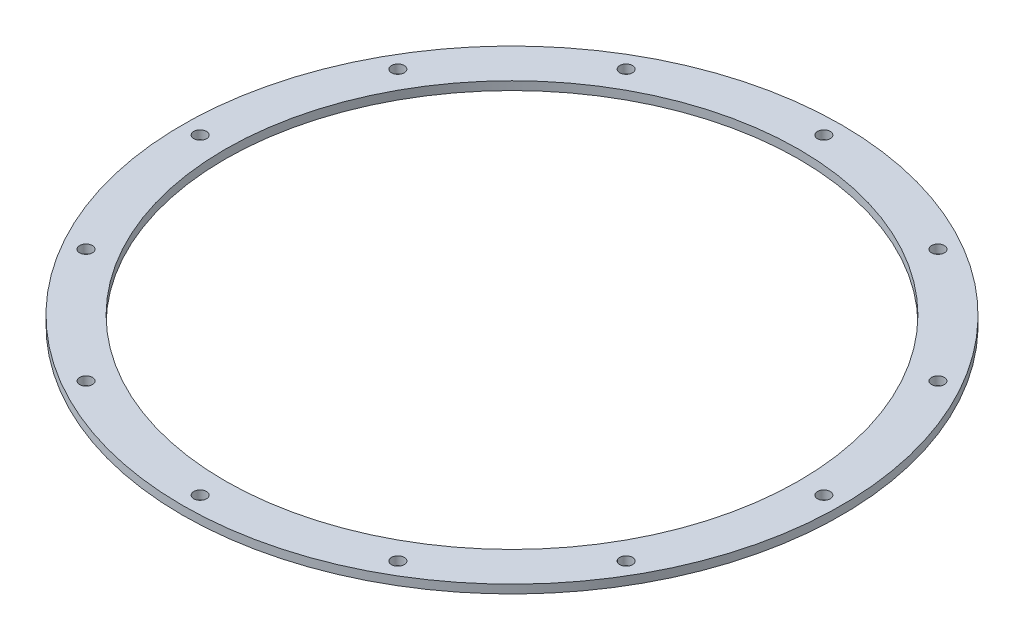
ISO-10303-21;
HEADER;
FILE_DESCRIPTION(('STEP AP214'),'2;1');
FILE_NAME('part.step','',(''),(''),'','','');
FILE_SCHEMA(('AUTOMOTIVE_DESIGN { 1 0 10303 214 1 1 1 1 }'));
ENDSEC;
DATA;
#1=APPLICATION_CONTEXT('core data for automotive mechanical design processes');
#2=APPLICATION_PROTOCOL_DEFINITION('international standard','automotive_design',2000,#1);
#3=PRODUCT_CONTEXT('',#1,'mechanical');
#4=PRODUCT('Part','Part','',(#3));
#5=PRODUCT_RELATED_PRODUCT_CATEGORY('part','',(#4));
#6=PRODUCT_DEFINITION_FORMATION('','',#4);
#7=PRODUCT_DEFINITION_CONTEXT('part definition',#1,'design');
#8=PRODUCT_DEFINITION('design','',#6,#7);
#9=PRODUCT_DEFINITION_SHAPE('','',#8);
#10=(LENGTH_UNIT() NAMED_UNIT(*) SI_UNIT(.MILLI.,.METRE.));
#11=(NAMED_UNIT(*) PLANE_ANGLE_UNIT() SI_UNIT($,.RADIAN.));
#12=(NAMED_UNIT(*) SI_UNIT($,.STERADIAN.) SOLID_ANGLE_UNIT());
#13=UNCERTAINTY_MEASURE_WITH_UNIT(LENGTH_MEASURE(1.E-05),#10,'distance_accuracy_value','');
#14=(GEOMETRIC_REPRESENTATION_CONTEXT(3) GLOBAL_UNCERTAINTY_ASSIGNED_CONTEXT((#13)) GLOBAL_UNIT_ASSIGNED_CONTEXT((#10,
#11,#12)) REPRESENTATION_CONTEXT('',''));
#15=CARTESIAN_POINT('',(0.,0.,0.));
#16=DIRECTION('',(0.,0.,1.));
#17=DIRECTION('',(1.,0.,0.));
#18=AXIS2_PLACEMENT_3D('',#15,#16,#17);
#19=CARTESIAN_POINT('',(0.,6.00000000000001,0.));
#20=DIRECTION('',(0.,1.,0.));
#21=DIRECTION('',(0.,0.,1.));
#22=AXIS2_PLACEMENT_3D('',#19,#20,#21);
#23=PLANE('',#22);
#24=CARTESIAN_POINT('',(-190.525588832577,6.00000000000001,-110.));
#25=DIRECTION('',(0.,1.,0.));
#26=DIRECTION('',(0.86602540378444,0.,0.499999999999998));
#27=AXIS2_PLACEMENT_3D('',#24,#25,#26);
#28=CIRCLE('',#27,4.5);
#29=CARTESIAN_POINT('',(-186.628474515547,6.00000000000001,-107.75));
#30=VERTEX_POINT('',#29);
#31=EDGE_CURVE('E128',#30,#30,#28,.T.);
#32=ORIENTED_EDGE('',*,*,#31,.F.);
#33=EDGE_LOOP('',(#32));
#34=FACE_BOUND('',#33,.T.);
#35=CARTESIAN_POINT('',(-220.,6.00000000000001,7.6812589454549E-13));
#36=DIRECTION('',(0.,1.,0.));
#37=DIRECTION('',(1.,0.,0.));
#38=AXIS2_PLACEMENT_3D('',#35,#36,#37);
#39=CIRCLE('',#38,4.5);
#40=CARTESIAN_POINT('',(-215.5,6.00000000000001,7.52414228520696E-13));
#41=VERTEX_POINT('',#40);
#42=EDGE_CURVE('E120',#41,#41,#39,.T.);
#43=ORIENTED_EDGE('',*,*,#42,.F.);
#44=EDGE_LOOP('',(#43));
#45=FACE_BOUND('',#44,.T.);
#46=CARTESIAN_POINT('',(-190.525588832576,6.00000000000001,110.000000000001));
#47=DIRECTION('',(0.,1.,0.));
#48=DIRECTION('',(0.866025403784437,0.,-0.500000000000004));
#49=AXIS2_PLACEMENT_3D('',#46,#47,#48);
#50=CIRCLE('',#49,4.5);
#51=CARTESIAN_POINT('',(-186.628474515546,6.00000000000001,107.750000000001));
#52=VERTEX_POINT('',#51);
#53=EDGE_CURVE('E112',#52,#52,#50,.T.);
#54=ORIENTED_EDGE('',*,*,#53,.F.);
#55=EDGE_LOOP('',(#54));
#56=FACE_BOUND('',#55,.T.);
#57=CARTESIAN_POINT('',(-109.999999999999,6.00000000000001,190.525588832577));
#58=DIRECTION('',(0.,1.,0.));
#59=DIRECTION('',(0.499999999999995,0.,-0.866025403784442));
#60=AXIS2_PLACEMENT_3D('',#57,#58,#59);
#61=CIRCLE('',#60,4.5);
#62=CARTESIAN_POINT('',(-107.749999999999,6.00000000000001,186.628474515547));
#63=VERTEX_POINT('',#62);
#64=EDGE_CURVE('E104',#63,#63,#61,.T.);
#65=ORIENTED_EDGE('',*,*,#64,.F.);
#66=EDGE_LOOP('',(#65));
#67=FACE_BOUND('',#66,.T.);
#68=CARTESIAN_POINT('',(0.,6.00000000000001,220.));
#69=DIRECTION('',(0.,1.,0.));
#70=DIRECTION('',(0.,0.,-1.));
#71=AXIS2_PLACEMENT_3D('',#68,#69,#70);
#72=CIRCLE('',#71,4.5);
#73=CARTESIAN_POINT('',(0.,6.00000000000001,215.5));
#74=VERTEX_POINT('',#73);
#75=EDGE_CURVE('E96',#74,#74,#72,.T.);
#76=ORIENTED_EDGE('',*,*,#75,.F.);
#77=EDGE_LOOP('',(#76));
#78=FACE_BOUND('',#77,.T.);
#79=CARTESIAN_POINT('',(110.000000000002,6.00000000000001,190.525588832576));
#80=DIRECTION('',(0.,1.,0.));
#81=DIRECTION('',(-0.500000000000007,0.,-0.866025403784435));
#82=AXIS2_PLACEMENT_3D('',#79,#80,#81);
#83=CIRCLE('',#82,4.5);
#84=CARTESIAN_POINT('',(107.750000000002,6.00000000000001,186.628474515546));
#85=VERTEX_POINT('',#84);
#86=EDGE_CURVE('E88',#85,#85,#83,.T.);
#87=ORIENTED_EDGE('',*,*,#86,.F.);
#88=EDGE_LOOP('',(#87));
#89=FACE_BOUND('',#88,.T.);
#90=CARTESIAN_POINT('',(190.525588832578,6.00000000000001,109.999999999998));
#91=DIRECTION('',(0.,1.,0.));
#92=DIRECTION('',(-0.866025403784444,0.,-0.499999999999992));
#93=AXIS2_PLACEMENT_3D('',#90,#91,#92);
#94=CIRCLE('',#93,4.5);
#95=CARTESIAN_POINT('',(186.628474515548,6.00000000000001,107.749999999998));
#96=VERTEX_POINT('',#95);
#97=EDGE_CURVE('E78',#96,#96,#94,.T.);
#98=ORIENTED_EDGE('',*,*,#97,.F.);
#99=EDGE_LOOP('',(#98));
#100=FACE_BOUND('',#99,.T.);
#101=CARTESIAN_POINT('',(220.,6.00000000000001,-2.30437768363647E-12));
#102=DIRECTION('',(0.,1.,0.));
#103=DIRECTION('',(-1.,0.,0.));
#104=AXIS2_PLACEMENT_3D('',#101,#102,#103);
#105=CIRCLE('',#104,4.5);
#106=CARTESIAN_POINT('',(215.5,6.00000000000001,-2.25724268556209E-12));
#107=VERTEX_POINT('',#106);
#108=EDGE_CURVE('E79',#107,#107,#105,.T.);
#109=ORIENTED_EDGE('',*,*,#108,.F.);
#110=EDGE_LOOP('',(#109));
#111=FACE_BOUND('',#110,.T.);
#112=CARTESIAN_POINT('',(190.525588832575,6.00000000000001,-110.000000000002));
#113=DIRECTION('',(0.,1.,0.));
#114=DIRECTION('',(-0.866025403784433,0.,0.50000000000001));
#115=AXIS2_PLACEMENT_3D('',#112,#113,#114);
#116=CIRCLE('',#115,4.5);
#117=CARTESIAN_POINT('',(186.628474515545,6.00000000000001,-107.750000000002));
#118=VERTEX_POINT('',#117);
#119=EDGE_CURVE('E142',#118,#118,#116,.T.);
#120=ORIENTED_EDGE('',*,*,#119,.F.);
#121=EDGE_LOOP('',(#120));
#122=FACE_BOUND('',#121,.T.);
#123=CARTESIAN_POINT('',(109.999999999998,6.00000000000001,-190.525588832578));
#124=DIRECTION('',(0.,1.,0.));
#125=DIRECTION('',(-0.499999999999989,0.,0.866025403784445));
#126=AXIS2_PLACEMENT_3D('',#123,#124,#125);
#127=CIRCLE('',#126,4.5);
#128=CARTESIAN_POINT('',(107.749999999998,6.00000000000001,-186.628474515548));
#129=VERTEX_POINT('',#128);
#130=EDGE_CURVE('E143',#129,#129,#127,.T.);
#131=ORIENTED_EDGE('',*,*,#130,.F.);
#132=EDGE_LOOP('',(#131));
#133=FACE_BOUND('',#132,.T.);
#134=CARTESIAN_POINT('',(-110.,6.00000000000001,-190.525588832576));
#135=DIRECTION('',(0.,1.,0.));
#136=DIRECTION('',(0.500000000000001,0.,0.866025403784438));
#137=AXIS2_PLACEMENT_3D('',#134,#135,#136);
#138=CIRCLE('',#137,4.5);
#139=CARTESIAN_POINT('',(-107.75,6.00000000000001,-186.628474515547));
#140=VERTEX_POINT('',#139);
#141=EDGE_CURVE('E69',#140,#140,#138,.T.);
#142=ORIENTED_EDGE('',*,*,#141,.F.);
#143=EDGE_LOOP('',(#142));
#144=FACE_BOUND('',#143,.T.);
#145=CARTESIAN_POINT('',(0.,6.00000000000001,-220.));
#146=DIRECTION('',(0.,1.,0.));
#147=DIRECTION('',(0.,0.,1.));
#148=AXIS2_PLACEMENT_3D('',#145,#146,#147);
#149=CIRCLE('',#148,4.5);
#150=CARTESIAN_POINT('',(0.,6.00000000000001,-215.5));
#151=VERTEX_POINT('',#150);
#152=EDGE_CURVE('E61',#151,#151,#149,.T.);
#153=ORIENTED_EDGE('',*,*,#152,.F.);
#154=EDGE_LOOP('',(#153));
#155=FACE_BOUND('',#154,.T.);
#156=CARTESIAN_POINT('',(0.,6.00000000000001,0.));
#157=DIRECTION('',(0.,1.,0.));
#158=DIRECTION('',(0.,0.,1.));
#159=AXIS2_PLACEMENT_3D('',#156,#157,#158);
#160=CIRCLE('',#159,232.5);
#161=CARTESIAN_POINT('',(0.,6.00000000000001,232.5));
#162=VERTEX_POINT('',#161);
#163=EDGE_CURVE('E10',#162,#162,#160,.T.);
#164=ORIENTED_EDGE('',*,*,#163,.T.);
#165=EDGE_LOOP('',(#164));
#166=FACE_BOUND('',#165,.T.);
#167=CARTESIAN_POINT('',(0.,6.00000000000001,0.));
#168=DIRECTION('',(0.,1.,0.));
#169=DIRECTION('',(0.,0.,1.));
#170=AXIS2_PLACEMENT_3D('',#167,#168,#169);
#171=CIRCLE('',#170,202.5);
#172=CARTESIAN_POINT('',(0.,6.00000000000001,202.5));
#173=VERTEX_POINT('',#172);
#174=EDGE_CURVE('E52',#173,#173,#171,.T.);
#175=ORIENTED_EDGE('',*,*,#174,.F.);
#176=EDGE_LOOP('',(#175));
#177=FACE_BOUND('',#176,.T.);
#178=ADVANCED_FACE('F36',(#34,#45,#56,#67,#78,#89,#100,#111,#122,#133,#144,#155,#166,#177),#23,.T.);
#179=CARTESIAN_POINT('',(0.,0.,0.));
#180=DIRECTION('',(0.,1.,0.));
#181=DIRECTION('',(0.,0.,1.));
#182=AXIS2_PLACEMENT_3D('',#179,#180,#181);
#183=PLANE('',#182);
#184=CARTESIAN_POINT('',(-190.525588832577,0.,-110.));
#185=DIRECTION('',(0.,1.,0.));
#186=DIRECTION('',(0.86602540378444,0.,0.499999999999998));
#187=AXIS2_PLACEMENT_3D('',#184,#185,#186);
#188=CIRCLE('',#187,4.5);
#189=CARTESIAN_POINT('',(-186.628474515547,0.,-107.75));
#190=VERTEX_POINT('',#189);
#191=EDGE_CURVE('E73',#190,#190,#188,.T.);
#192=ORIENTED_EDGE('',*,*,#191,.T.);
#193=EDGE_LOOP('',(#192));
#194=FACE_BOUND('',#193,.T.);
#195=CARTESIAN_POINT('',(-220.,0.,7.6812589454549E-13));
#196=DIRECTION('',(0.,1.,0.));
#197=DIRECTION('',(1.,0.,0.));
#198=AXIS2_PLACEMENT_3D('',#195,#196,#197);
#199=CIRCLE('',#198,4.5);
#200=CARTESIAN_POINT('',(-215.5,0.,7.52414228520696E-13));
#201=VERTEX_POINT('',#200);
#202=EDGE_CURVE('E124',#201,#201,#199,.T.);
#203=ORIENTED_EDGE('',*,*,#202,.T.);
#204=EDGE_LOOP('',(#203));
#205=FACE_BOUND('',#204,.T.);
#206=CARTESIAN_POINT('',(-190.525588832576,0.,110.000000000001));
#207=DIRECTION('',(0.,1.,0.));
#208=DIRECTION('',(0.866025403784437,0.,-0.500000000000004));
#209=AXIS2_PLACEMENT_3D('',#206,#207,#208);
#210=CIRCLE('',#209,4.5);
#211=CARTESIAN_POINT('',(-186.628474515546,0.,107.750000000001));
#212=VERTEX_POINT('',#211);
#213=EDGE_CURVE('E116',#212,#212,#210,.T.);
#214=ORIENTED_EDGE('',*,*,#213,.T.);
#215=EDGE_LOOP('',(#214));
#216=FACE_BOUND('',#215,.T.);
#217=CARTESIAN_POINT('',(-109.999999999999,0.,190.525588832577));
#218=DIRECTION('',(0.,1.,0.));
#219=DIRECTION('',(0.499999999999995,0.,-0.866025403784442));
#220=AXIS2_PLACEMENT_3D('',#217,#218,#219);
#221=CIRCLE('',#220,4.5);
#222=CARTESIAN_POINT('',(-107.749999999999,0.,186.628474515547));
#223=VERTEX_POINT('',#222);
#224=EDGE_CURVE('E108',#223,#223,#221,.T.);
#225=ORIENTED_EDGE('',*,*,#224,.T.);
#226=EDGE_LOOP('',(#225));
#227=FACE_BOUND('',#226,.T.);
#228=CARTESIAN_POINT('',(0.,0.,220.));
#229=DIRECTION('',(0.,1.,0.));
#230=DIRECTION('',(0.,0.,-1.));
#231=AXIS2_PLACEMENT_3D('',#228,#229,#230);
#232=CIRCLE('',#231,4.5);
#233=CARTESIAN_POINT('',(0.,0.,215.5));
#234=VERTEX_POINT('',#233);
#235=EDGE_CURVE('E100',#234,#234,#232,.T.);
#236=ORIENTED_EDGE('',*,*,#235,.T.);
#237=EDGE_LOOP('',(#236));
#238=FACE_BOUND('',#237,.T.);
#239=CARTESIAN_POINT('',(110.000000000002,0.,190.525588832576));
#240=DIRECTION('',(0.,1.,0.));
#241=DIRECTION('',(-0.500000000000007,0.,-0.866025403784435));
#242=AXIS2_PLACEMENT_3D('',#239,#240,#241);
#243=CIRCLE('',#242,4.5);
#244=CARTESIAN_POINT('',(107.750000000002,0.,186.628474515546));
#245=VERTEX_POINT('',#244);
#246=EDGE_CURVE('E92',#245,#245,#243,.T.);
#247=ORIENTED_EDGE('',*,*,#246,.T.);
#248=EDGE_LOOP('',(#247));
#249=FACE_BOUND('',#248,.T.);
#250=CARTESIAN_POINT('',(190.525588832578,0.,109.999999999998));
#251=DIRECTION('',(0.,1.,0.));
#252=DIRECTION('',(-0.866025403784444,0.,-0.499999999999992));
#253=AXIS2_PLACEMENT_3D('',#250,#251,#252);
#254=CIRCLE('',#253,4.5);
#255=CARTESIAN_POINT('',(186.628474515548,0.,107.749999999998));
#256=VERTEX_POINT('',#255);
#257=EDGE_CURVE('E84',#256,#256,#254,.T.);
#258=ORIENTED_EDGE('',*,*,#257,.T.);
#259=EDGE_LOOP('',(#258));
#260=FACE_BOUND('',#259,.T.);
#261=CARTESIAN_POINT('',(220.,0.,-2.30437768363647E-12));
#262=DIRECTION('',(0.,1.,0.));
#263=DIRECTION('',(-1.,0.,0.));
#264=AXIS2_PLACEMENT_3D('',#261,#262,#263);
#265=CIRCLE('',#264,4.5);
#266=CARTESIAN_POINT('',(215.5,0.,-2.25724268556209E-12));
#267=VERTEX_POINT('',#266);
#268=EDGE_CURVE('E74',#267,#267,#265,.T.);
#269=ORIENTED_EDGE('',*,*,#268,.T.);
#270=EDGE_LOOP('',(#269));
#271=FACE_BOUND('',#270,.T.);
#272=CARTESIAN_POINT('',(190.525588832575,0.,-110.000000000002));
#273=DIRECTION('',(0.,1.,0.));
#274=DIRECTION('',(-0.866025403784433,0.,0.50000000000001));
#275=AXIS2_PLACEMENT_3D('',#272,#273,#274);
#276=CIRCLE('',#275,4.5);
#277=CARTESIAN_POINT('',(186.628474515545,0.,-107.750000000002));
#278=VERTEX_POINT('',#277);
#279=EDGE_CURVE('E83',#278,#278,#276,.T.);
#280=ORIENTED_EDGE('',*,*,#279,.T.);
#281=EDGE_LOOP('',(#280));
#282=FACE_BOUND('',#281,.T.);
#283=CARTESIAN_POINT('',(109.999999999998,0.,-190.525588832578));
#284=DIRECTION('',(0.,1.,0.));
#285=DIRECTION('',(-0.499999999999989,0.,0.866025403784445));
#286=AXIS2_PLACEMENT_3D('',#283,#284,#285);
#287=CIRCLE('',#286,4.5);
#288=CARTESIAN_POINT('',(107.749999999998,0.,-186.628474515548));
#289=VERTEX_POINT('',#288);
#290=EDGE_CURVE('E138',#289,#289,#287,.T.);
#291=ORIENTED_EDGE('',*,*,#290,.T.);
#292=EDGE_LOOP('',(#291));
#293=FACE_BOUND('',#292,.T.);
#294=CARTESIAN_POINT('',(-110.,0.,-190.525588832576));
#295=DIRECTION('',(0.,1.,0.));
#296=DIRECTION('',(0.500000000000001,0.,0.866025403784438));
#297=AXIS2_PLACEMENT_3D('',#294,#295,#296);
#298=CIRCLE('',#297,4.5);
#299=CARTESIAN_POINT('',(-107.75,0.,-186.628474515547));
#300=VERTEX_POINT('',#299);
#301=EDGE_CURVE('E65',#300,#300,#298,.T.);
#302=ORIENTED_EDGE('',*,*,#301,.T.);
#303=EDGE_LOOP('',(#302));
#304=FACE_BOUND('',#303,.T.);
#305=CARTESIAN_POINT('',(0.,0.,-220.));
#306=DIRECTION('',(0.,1.,0.));
#307=DIRECTION('',(0.,0.,1.));
#308=AXIS2_PLACEMENT_3D('',#305,#306,#307);
#309=CIRCLE('',#308,4.5);
#310=CARTESIAN_POINT('',(0.,0.,-215.5));
#311=VERTEX_POINT('',#310);
#312=EDGE_CURVE('E40',#311,#311,#309,.T.);
#313=ORIENTED_EDGE('',*,*,#312,.T.);
#314=EDGE_LOOP('',(#313));
#315=FACE_BOUND('',#314,.T.);
#316=CARTESIAN_POINT('',(0.,0.,0.));
#317=DIRECTION('',(0.,1.,0.));
#318=DIRECTION('',(0.,0.,1.));
#319=AXIS2_PLACEMENT_3D('',#316,#317,#318);
#320=CIRCLE('',#319,232.5);
#321=CARTESIAN_POINT('',(0.,0.,232.5));
#322=VERTEX_POINT('',#321);
#323=EDGE_CURVE('E45',#322,#322,#320,.T.);
#324=ORIENTED_EDGE('',*,*,#323,.F.);
#325=EDGE_LOOP('',(#324));
#326=FACE_BOUND('',#325,.T.);
#327=CARTESIAN_POINT('',(0.,0.,0.));
#328=DIRECTION('',(0.,1.,0.));
#329=DIRECTION('',(0.,0.,1.));
#330=AXIS2_PLACEMENT_3D('',#327,#328,#329);
#331=CIRCLE('',#330,202.5);
#332=CARTESIAN_POINT('',(0.,0.,202.5));
#333=VERTEX_POINT('',#332);
#334=EDGE_CURVE('E54',#333,#333,#331,.T.);
#335=ORIENTED_EDGE('',*,*,#334,.T.);
#336=EDGE_LOOP('',(#335));
#337=FACE_BOUND('',#336,.T.);
#338=ADVANCED_FACE('F160',(#194,#205,#216,#227,#238,#249,#260,#271,#282,#293,#304,#315,#326,
#337),#183,.F.);
#339=CARTESIAN_POINT('',(0.,6.00000000000001,0.));
#340=DIRECTION('',(0.,-1.,0.));
#341=DIRECTION('',(0.,0.,-1.));
#342=AXIS2_PLACEMENT_3D('',#339,#340,#341);
#343=CYLINDRICAL_SURFACE('',#342,232.5);
#344=ORIENTED_EDGE('',*,*,#163,.F.);
#345=EDGE_LOOP('',(#344));
#346=FACE_BOUND('',#345,.T.);
#347=ORIENTED_EDGE('',*,*,#323,.T.);
#348=EDGE_LOOP('',(#347));
#349=FACE_BOUND('',#348,.T.);
#350=ADVANCED_FACE('F38',(#346,#349),#343,.T.);
#351=CARTESIAN_POINT('',(0.,6.00000000000001,0.));
#352=DIRECTION('',(0.,-1.,0.));
#353=DIRECTION('',(0.,0.,-1.));
#354=AXIS2_PLACEMENT_3D('',#351,#352,#353);
#355=CYLINDRICAL_SURFACE('',#354,202.5);
#356=ORIENTED_EDGE('',*,*,#174,.T.);
#357=EDGE_LOOP('',(#356));
#358=FACE_BOUND('',#357,.T.);
#359=ORIENTED_EDGE('',*,*,#334,.F.);
#360=EDGE_LOOP('',(#359));
#361=FACE_BOUND('',#360,.T.);
#362=ADVANCED_FACE('F171',(#358,#361),#355,.F.);
#363=CARTESIAN_POINT('',(0.,-4.,-220.));
#364=DIRECTION('',(0.,1.,0.));
#365=DIRECTION('',(0.,0.,1.));
#366=AXIS2_PLACEMENT_3D('',#363,#364,#365);
#367=CYLINDRICAL_SURFACE('',#366,4.5);
#368=ORIENTED_EDGE('',*,*,#152,.T.);
#369=EDGE_LOOP('',(#368));
#370=FACE_BOUND('',#369,.T.);
#371=ORIENTED_EDGE('',*,*,#312,.F.);
#372=EDGE_LOOP('',(#371));
#373=FACE_BOUND('',#372,.T.);
#374=ADVANCED_FACE('F174',(#370,#373),#367,.F.);
#375=CARTESIAN_POINT('',(-110.,-4.,-190.525588832576));
#376=DIRECTION('',(0.,1.,0.));
#377=DIRECTION('',(0.500000000000001,0.,0.866025403784438));
#378=AXIS2_PLACEMENT_3D('',#375,#376,#377);
#379=CYLINDRICAL_SURFACE('',#378,4.5);
#380=ORIENTED_EDGE('',*,*,#141,.T.);
#381=EDGE_LOOP('',(#380));
#382=FACE_BOUND('',#381,.T.);
#383=ORIENTED_EDGE('',*,*,#301,.F.);
#384=EDGE_LOOP('',(#383));
#385=FACE_BOUND('',#384,.T.);
#386=ADVANCED_FACE('F188',(#382,#385),#379,.F.);
#387=CARTESIAN_POINT('',(109.999999999998,-4.,-190.525588832578));
#388=DIRECTION('',(0.,1.,0.));
#389=DIRECTION('',(-0.499999999999989,0.,0.866025403784445));
#390=AXIS2_PLACEMENT_3D('',#387,#388,#389);
#391=CYLINDRICAL_SURFACE('',#390,4.5);
#392=ORIENTED_EDGE('',*,*,#130,.T.);
#393=EDGE_LOOP('',(#392));
#394=FACE_BOUND('',#393,.T.);
#395=ORIENTED_EDGE('',*,*,#290,.F.);
#396=EDGE_LOOP('',(#395));
#397=FACE_BOUND('',#396,.T.);
#398=ADVANCED_FACE('F192',(#394,#397),#391,.F.);
#399=CARTESIAN_POINT('',(190.525588832575,-4.,-110.000000000002));
#400=DIRECTION('',(0.,1.,0.));
#401=DIRECTION('',(-0.866025403784433,0.,0.50000000000001));
#402=AXIS2_PLACEMENT_3D('',#399,#400,#401);
#403=CYLINDRICAL_SURFACE('',#402,4.5);
#404=ORIENTED_EDGE('',*,*,#119,.T.);
#405=EDGE_LOOP('',(#404));
#406=FACE_BOUND('',#405,.T.);
#407=ORIENTED_EDGE('',*,*,#279,.F.);
#408=EDGE_LOOP('',(#407));
#409=FACE_BOUND('',#408,.T.);
#410=ADVANCED_FACE('F155',(#406,#409),#403,.F.);
#411=CARTESIAN_POINT('',(220.,-4.,-2.30437768363647E-12));
#412=DIRECTION('',(0.,1.,0.));
#413=DIRECTION('',(-1.,0.,0.));
#414=AXIS2_PLACEMENT_3D('',#411,#412,#413);
#415=CYLINDRICAL_SURFACE('',#414,4.5);
#416=ORIENTED_EDGE('',*,*,#108,.T.);
#417=EDGE_LOOP('',(#416));
#418=FACE_BOUND('',#417,.T.);
#419=ORIENTED_EDGE('',*,*,#268,.F.);
#420=EDGE_LOOP('',(#419));
#421=FACE_BOUND('',#420,.T.);
#422=ADVANCED_FACE('F194',(#418,#421),#415,.F.);
#423=CARTESIAN_POINT('',(190.525588832578,-4.,109.999999999998));
#424=DIRECTION('',(0.,1.,0.));
#425=DIRECTION('',(-0.866025403784444,0.,-0.499999999999992));
#426=AXIS2_PLACEMENT_3D('',#423,#424,#425);
#427=CYLINDRICAL_SURFACE('',#426,4.5);
#428=ORIENTED_EDGE('',*,*,#97,.T.);
#429=EDGE_LOOP('',(#428));
#430=FACE_BOUND('',#429,.T.);
#431=ORIENTED_EDGE('',*,*,#257,.F.);
#432=EDGE_LOOP('',(#431));
#433=FACE_BOUND('',#432,.T.);
#434=ADVANCED_FACE('F197',(#430,#433),#427,.F.);
#435=CARTESIAN_POINT('',(110.000000000002,-4.,190.525588832576));
#436=DIRECTION('',(0.,1.,0.));
#437=DIRECTION('',(-0.500000000000007,0.,-0.866025403784435));
#438=AXIS2_PLACEMENT_3D('',#435,#436,#437);
#439=CYLINDRICAL_SURFACE('',#438,4.5);
#440=ORIENTED_EDGE('',*,*,#86,.T.);
#441=EDGE_LOOP('',(#440));
#442=FACE_BOUND('',#441,.T.);
#443=ORIENTED_EDGE('',*,*,#246,.F.);
#444=EDGE_LOOP('',(#443));
#445=FACE_BOUND('',#444,.T.);
#446=ADVANCED_FACE('F201',(#442,#445),#439,.F.);
#447=CARTESIAN_POINT('',(0.,-4.,220.));
#448=DIRECTION('',(0.,1.,0.));
#449=DIRECTION('',(0.,0.,-1.));
#450=AXIS2_PLACEMENT_3D('',#447,#448,#449);
#451=CYLINDRICAL_SURFACE('',#450,4.5);
#452=ORIENTED_EDGE('',*,*,#75,.T.);
#453=EDGE_LOOP('',(#452));
#454=FACE_BOUND('',#453,.T.);
#455=ORIENTED_EDGE('',*,*,#235,.F.);
#456=EDGE_LOOP('',(#455));
#457=FACE_BOUND('',#456,.T.);
#458=ADVANCED_FACE('F205',(#454,#457),#451,.F.);
#459=CARTESIAN_POINT('',(-109.999999999999,-4.,190.525588832577));
#460=DIRECTION('',(0.,1.,0.));
#461=DIRECTION('',(0.499999999999995,0.,-0.866025403784442));
#462=AXIS2_PLACEMENT_3D('',#459,#460,#461);
#463=CYLINDRICAL_SURFACE('',#462,4.5);
#464=ORIENTED_EDGE('',*,*,#64,.T.);
#465=EDGE_LOOP('',(#464));
#466=FACE_BOUND('',#465,.T.);
#467=ORIENTED_EDGE('',*,*,#224,.F.);
#468=EDGE_LOOP('',(#467));
#469=FACE_BOUND('',#468,.T.);
#470=ADVANCED_FACE('F209',(#466,#469),#463,.F.);
#471=CARTESIAN_POINT('',(-190.525588832576,-4.,110.000000000001));
#472=DIRECTION('',(0.,1.,0.));
#473=DIRECTION('',(0.866025403784437,0.,-0.500000000000004));
#474=AXIS2_PLACEMENT_3D('',#471,#472,#473);
#475=CYLINDRICAL_SURFACE('',#474,4.5);
#476=ORIENTED_EDGE('',*,*,#53,.T.);
#477=EDGE_LOOP('',(#476));
#478=FACE_BOUND('',#477,.T.);
#479=ORIENTED_EDGE('',*,*,#213,.F.);
#480=EDGE_LOOP('',(#479));
#481=FACE_BOUND('',#480,.T.);
#482=ADVANCED_FACE('F213',(#478,#481),#475,.F.);
#483=CARTESIAN_POINT('',(-220.,-4.,7.6812589454549E-13));
#484=DIRECTION('',(0.,1.,0.));
#485=DIRECTION('',(1.,0.,0.));
#486=AXIS2_PLACEMENT_3D('',#483,#484,#485);
#487=CYLINDRICAL_SURFACE('',#486,4.5);
#488=ORIENTED_EDGE('',*,*,#42,.T.);
#489=EDGE_LOOP('',(#488));
#490=FACE_BOUND('',#489,.T.);
#491=ORIENTED_EDGE('',*,*,#202,.F.);
#492=EDGE_LOOP('',(#491));
#493=FACE_BOUND('',#492,.T.);
#494=ADVANCED_FACE('F217',(#490,#493),#487,.F.);
#495=CARTESIAN_POINT('',(-190.525588832577,-4.,-110.));
#496=DIRECTION('',(0.,1.,0.));
#497=DIRECTION('',(0.86602540378444,0.,0.499999999999998));
#498=AXIS2_PLACEMENT_3D('',#495,#496,#497);
#499=CYLINDRICAL_SURFACE('',#498,4.5);
#500=ORIENTED_EDGE('',*,*,#31,.T.);
#501=EDGE_LOOP('',(#500));
#502=FACE_BOUND('',#501,.T.);
#503=ORIENTED_EDGE('',*,*,#191,.F.);
#504=EDGE_LOOP('',(#503));
#505=FACE_BOUND('',#504,.T.);
#506=ADVANCED_FACE('F221',(#502,#505),#499,.F.);
#507=CLOSED_SHELL('',(#178,#338,#350,#362,#374,#386,#398,#410,#422,#434,#446,#458,#470,#482,
#494,#506));
#508=MANIFOLD_SOLID_BREP('B2',#507);
#509=ADVANCED_BREP_SHAPE_REPRESENTATION('',(#18,#508),#14);
#510=SHAPE_DEFINITION_REPRESENTATION(#9,#509);
ENDSEC;
END-ISO-10303-21;
